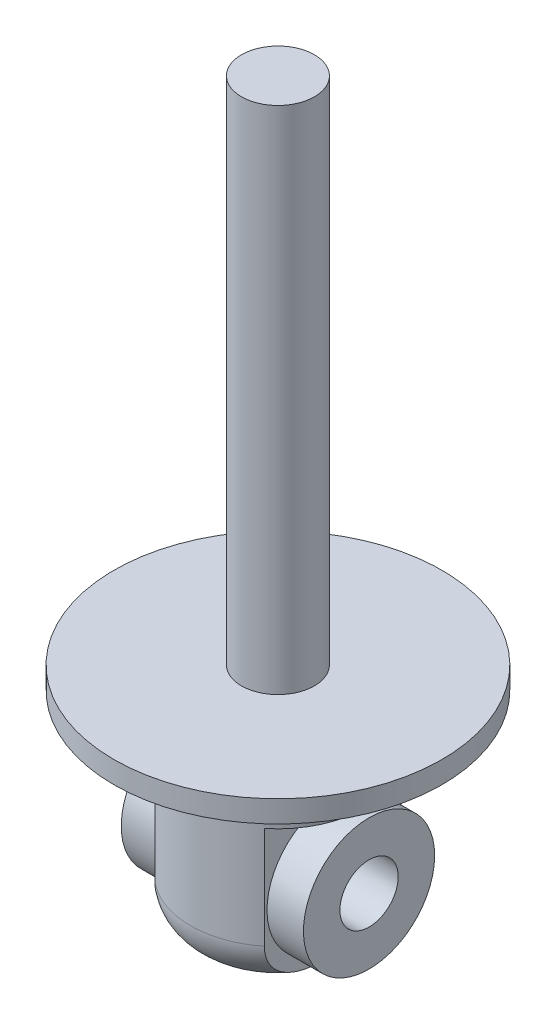
ISO-10303-21;
HEADER;
FILE_DESCRIPTION(('STEP AP214'),'2;1');
FILE_NAME('part.step','',(''),(''),'','','');
FILE_SCHEMA(('AUTOMOTIVE_DESIGN { 1 0 10303 214 1 1 1 1 }'));
ENDSEC;
DATA;
#1=APPLICATION_CONTEXT('core data for automotive mechanical design processes');
#2=APPLICATION_PROTOCOL_DEFINITION('international standard','automotive_design',2000,#1);
#3=PRODUCT_CONTEXT('',#1,'mechanical');
#4=PRODUCT('Part','Part','',(#3));
#5=PRODUCT_RELATED_PRODUCT_CATEGORY('part','',(#4));
#6=PRODUCT_DEFINITION_FORMATION('','',#4);
#7=PRODUCT_DEFINITION_CONTEXT('part definition',#1,'design');
#8=PRODUCT_DEFINITION('design','',#6,#7);
#9=PRODUCT_DEFINITION_SHAPE('','',#8);
#10=(LENGTH_UNIT() NAMED_UNIT(*) SI_UNIT(.MILLI.,.METRE.));
#11=(NAMED_UNIT(*) PLANE_ANGLE_UNIT() SI_UNIT($,.RADIAN.));
#12=(NAMED_UNIT(*) SI_UNIT($,.STERADIAN.) SOLID_ANGLE_UNIT());
#13=UNCERTAINTY_MEASURE_WITH_UNIT(LENGTH_MEASURE(1.E-05),#10,'distance_accuracy_value','');
#14=(GEOMETRIC_REPRESENTATION_CONTEXT(3) GLOBAL_UNCERTAINTY_ASSIGNED_CONTEXT((#13)) GLOBAL_UNIT_ASSIGNED_CONTEXT((#10,
#11,#12)) REPRESENTATION_CONTEXT('',''));
#15=CARTESIAN_POINT('',(0.,0.,0.));
#16=DIRECTION('',(0.,0.,1.));
#17=DIRECTION('',(1.,0.,0.));
#18=AXIS2_PLACEMENT_3D('',#15,#16,#17);
#19=CARTESIAN_POINT('',(-7.5,-8.00000000000001,28.));
#20=DIRECTION('',(-1.,0.,0.));
#21=DIRECTION('',(0.,-1.,0.));
#22=AXIS2_PLACEMENT_3D('',#19,#20,#21);
#23=PLANE('',#22);
#24=DIRECTION('',(0.,1.,0.));
#25=VECTOR('',#24,1.);
#26=CARTESIAN_POINT('',(-7.5,-28.,9.3674969975976));
#27=LINE('',#26,#25);
#28=CARTESIAN_POINT('',(-7.5,-22.,9.3674969975976));
#29=VERTEX_POINT('',#28);
#30=CARTESIAN_POINT('',(-7.5,-8.00000000000001,9.3674969975976));
#31=VERTEX_POINT('',#30);
#32=EDGE_CURVE('E80',#29,#31,#27,.T.);
#33=ORIENTED_EDGE('',*,*,#32,.T.);
#34=DIRECTION('',(0.,0.,-1.));
#35=VECTOR('',#34,1.);
#36=CARTESIAN_POINT('',(-7.5,-8.00000000000001,28.));
#37=LINE('',#36,#35);
#38=CARTESIAN_POINT('',(-7.5,-8.00000000000001,-9.3674969975976));
#39=VERTEX_POINT('',#38);
#40=EDGE_CURVE('E83',#31,#39,#37,.T.);
#41=ORIENTED_EDGE('',*,*,#40,.T.);
#42=DIRECTION('',(0.,1.,0.));
#43=VECTOR('',#42,1.);
#44=CARTESIAN_POINT('',(-7.5,-28.,-9.3674969975976));
#45=LINE('',#44,#43);
#46=CARTESIAN_POINT('',(-7.5,-22.,-9.3674969975976));
#47=VERTEX_POINT('',#46);
#48=EDGE_CURVE('E63',#39,#47,#45,.F.);
#49=ORIENTED_EDGE('',*,*,#48,.T.);
#50=CARTESIAN_POINT('',(-7.5,-27.8094750193111,0.));
#51=CARTESIAN_POINT('',(-7.5,-27.8094752958151,-0.184521628242419));
#52=CARTESIAN_POINT('',(-7.5,-27.8077270322999,-0.369043480287191));
#53=CARTESIAN_POINT('',(-7.5,-27.8006130628877,-0.737999394292284));
#54=CARTESIAN_POINT('',(-7.5,-27.7952477367066,-0.922433463434384));
#55=CARTESIAN_POINT('',(-7.5,-27.780538513706,-1.29122559425462));
#56=CARTESIAN_POINT('',(-7.5,-27.7711929215574,-1.47558358999919));
#57=CARTESIAN_POINT('',(-7.5,-27.7479507640883,-1.84401846668315));
#58=CARTESIAN_POINT('',(-7.5,-27.734054140347,-2.02809534398339));
#59=CARTESIAN_POINT('',(-7.5,-27.701027325669,-2.39498843631837));
#60=CARTESIAN_POINT('',(-7.5,-27.6819201299087,-2.57780665418326));
#61=CARTESIAN_POINT('',(-7.5,-27.6375682217561,-2.94269408038083));
#62=CARTESIAN_POINT('',(-7.5,-27.6123230495969,-3.12476323156505));
#63=CARTESIAN_POINT('',(-7.5,-27.5259360262262,-3.6691632505479));
#64=CARTESIAN_POINT('',(-7.5,-27.4541196223952,-4.02997739530099));
#65=CARTESIAN_POINT('',(-7.5,-27.315114172541,-4.57935988961709));
#66=CARTESIAN_POINT('',(-7.5,-27.2608348848703,-4.77122256452969));
#67=CARTESIAN_POINT('',(-7.5,-27.1402411036094,-5.15109529504942));
#68=CARTESIAN_POINT('',(-7.5,-27.0739312594077,-5.33910680786539));
#69=CARTESIAN_POINT('',(-7.5,-26.928148698992,-5.70992505463463));
#70=CARTESIAN_POINT('',(-7.5,-26.8486797977089,-5.8927332791208));
#71=CARTESIAN_POINT('',(-7.5,-26.6756224712841,-6.25155879665883));
#72=CARTESIAN_POINT('',(-7.5,-26.5820364486502,-6.42757723883459));
#73=CARTESIAN_POINT('',(-7.5,-26.3958384208508,-6.74413785402998));
#74=CARTESIAN_POINT('',(-7.5,-26.3053527427416,-6.8859302136676));
#75=CARTESIAN_POINT('',(-7.5,-26.1136422044668,-7.16205254122039));
#76=CARTESIAN_POINT('',(-7.5,-26.0124194056704,-7.29638393401336));
#77=CARTESIAN_POINT('',(-7.5,-25.7991822855038,-7.55627452274061));
#78=CARTESIAN_POINT('',(-7.5,-25.6871652583255,-7.6818315054992));
#79=CARTESIAN_POINT('',(-7.5,-25.4525813942248,-7.92270374400352));
#80=CARTESIAN_POINT('',(-7.5,-25.3300144777409,-8.03801892249803));
#81=CARTESIAN_POINT('',(-7.5,-25.0736714823962,-8.25792234562975));
#82=CARTESIAN_POINT('',(-7.5,-24.9398051473305,-8.36240569865935));
#83=CARTESIAN_POINT('',(-7.5,-24.662616920615,-8.55796576900282));
#84=CARTESIAN_POINT('',(-7.5,-24.5192963548439,-8.64904436046083));
#85=CARTESIAN_POINT('',(-7.5,-24.2243409104845,-8.81636481076627));
#86=CARTESIAN_POINT('',(-7.5,-24.0727112205184,-8.89261579636784));
#87=CARTESIAN_POINT('',(-7.5,-23.7624095052739,-9.02909243430965));
#88=CARTESIAN_POINT('',(-7.5,-23.6037388369551,-9.08932115899453));
#89=CARTESIAN_POINT('',(-7.5,-23.3052245459151,-9.1849514334904));
#90=CARTESIAN_POINT('',(-7.5,-23.1661361294911,-9.22272405795734));
#91=CARTESIAN_POINT('',(-7.5,-22.8851087613884,-9.28547940350164));
#92=CARTESIAN_POINT('',(-7.5,-22.7431701638949,-9.31046370365637));
#93=CARTESIAN_POINT('',(-7.5,-22.4576599589478,-9.34730641699016));
#94=CARTESIAN_POINT('',(-7.5,-22.3140890586128,-9.35917031033292));
#95=CARTESIAN_POINT('',(-7.5,-22.0264648581988,-9.36963164548865));
#96=CARTESIAN_POINT('',(-7.5,-21.8824115750842,-9.36822954903948));
#97=CARTESIAN_POINT('',(-7.5,-21.6061914815275,-9.35280339576898));
#98=CARTESIAN_POINT('',(-7.5,-21.4739684759154,-9.33976569953801));
#99=CARTESIAN_POINT('',(-7.5,-21.2110534946456,-9.30256363878721));
#100=CARTESIAN_POINT('',(-7.5,-21.0803620180608,-9.27839574533066));
#101=CARTESIAN_POINT('',(-7.5,-20.8215410609612,-9.21922065645586));
#102=CARTESIAN_POINT('',(-7.5,-20.6934101253726,-9.18421981495561));
#103=CARTESIAN_POINT('',(-7.5,-20.4404340442512,-9.10374552536161));
#104=CARTESIAN_POINT('',(-7.5,-20.3155901493276,-9.05826815366643));
#105=CARTESIAN_POINT('',(-7.5,-20.0692031015505,-8.95699564520569));
#106=CARTESIAN_POINT('',(-7.5,-19.9476868658852,-8.90113499399756));
#107=CARTESIAN_POINT('',(-7.5,-19.7094920695403,-8.77987692751897));
#108=CARTESIAN_POINT('',(-7.5,-19.5928152563103,-8.71447610526943));
#109=CARTESIAN_POINT('',(-7.5,-19.2509911073174,-8.50489875856372));
#110=CARTESIAN_POINT('',(-7.5,-19.0339195251877,-8.34729299116935));
#111=CARTESIAN_POINT('',(-7.5,-18.609337427954,-7.98870608163153));
#112=CARTESIAN_POINT('',(-7.5,-18.4039002281567,-7.78529755950601));
#113=CARTESIAN_POINT('',(-7.5,-18.0246758733926,-7.35109040646743));
#114=CARTESIAN_POINT('',(-7.5,-17.8508837047537,-7.12029612399674));
#115=CARTESIAN_POINT('',(-7.5,-17.5744409595824,-6.69864287979115));
#116=CARTESIAN_POINT('',(-7.5,-17.4648689537028,-6.51223410047273));
#117=CARTESIAN_POINT('',(-7.5,-17.2626904112623,-6.13034538679086));
#118=CARTESIAN_POINT('',(-7.5,-17.1700919878543,-5.93486117014359));
#119=CARTESIAN_POINT('',(-7.5,-17.0006313082269,-5.53658641063458));
#120=CARTESIAN_POINT('',(-7.5,-16.9238147555949,-5.33377659321381));
#121=CARTESIAN_POINT('',(-7.5,-16.784875362625,-4.92331428460811));
#122=CARTESIAN_POINT('',(-7.5,-16.7227484430634,-4.71566315546475));
#123=CARTESIAN_POINT('',(-7.5,-16.5386673542946,-4.02250667384636));
#124=CARTESIAN_POINT('',(-7.5,-16.4449803111871,-3.52942656369883));
#125=CARTESIAN_POINT('',(-7.5,-16.3412352530644,-2.78498720051468));
#126=CARTESIAN_POINT('',(-7.5,-16.3127705467372,-2.53568557770051));
#127=CARTESIAN_POINT('',(-7.5,-16.2658269581612,-2.0361243493744));
#128=CARTESIAN_POINT('',(-7.5,-16.2473468655649,-1.78586486368144));
#129=CARTESIAN_POINT('',(-7.5,-16.2184283009414,-1.28363112408655));
#130=CARTESIAN_POINT('',(-7.5,-16.208031590786,-1.03165466176094));
#131=CARTESIAN_POINT('',(-7.5,-16.1941849220444,-0.527501194688707));
#132=CARTESIAN_POINT('',(-7.5,-16.1907352988047,-0.27532418084894));
#133=CARTESIAN_POINT('',(-7.5,-16.1903333462322,0.228731345602946));
#134=CARTESIAN_POINT('',(-7.5,-16.193373232494,0.480609853630145));
#135=CARTESIAN_POINT('',(-7.5,-16.2063332691715,0.984173581494236));
#136=CARTESIAN_POINT('',(-7.5,-16.2162528039696,1.23585881660871));
#137=CARTESIAN_POINT('',(-7.5,-16.2454935008677,1.7627882566893));
#138=CARTESIAN_POINT('',(-7.5,-16.2656211327378,2.03798990109168));
#139=CARTESIAN_POINT('',(-7.5,-16.3180418431017,2.58731345976836));
#140=CARTESIAN_POINT('',(-7.5,-16.3503365349836,2.86143522597441));
#141=CARTESIAN_POINT('',(-7.5,-16.4300545548583,3.40623279358435));
#142=CARTESIAN_POINT('',(-7.5,-16.4774071358833,3.67691867401872));
#143=CARTESIAN_POINT('',(-7.5,-16.5907053400646,4.2143947607995));
#144=CARTESIAN_POINT('',(-7.5,-16.6566449229111,4.48118620316469));
#145=CARTESIAN_POINT('',(-7.5,-16.7911834026755,4.94217748017442));
#146=CARTESIAN_POINT('',(-7.5,-16.8549558474619,5.13778160857807));
#147=CARTESIAN_POINT('',(-7.5,-16.9961265709521,5.52399422741739));
#148=CARTESIAN_POINT('',(-7.5,-17.0735207892669,5.71460418712136));
#149=CARTESIAN_POINT('',(-7.5,-17.2430793617625,6.08921987221889));
#150=CARTESIAN_POINT('',(-7.5,-17.3352463319138,6.27322442084438));
#151=CARTESIAN_POINT('',(-7.5,-17.5351759469553,6.63256976145457));
#152=CARTESIAN_POINT('',(-7.5,-17.6429345063483,6.80791280693597));
#153=CARTESIAN_POINT('',(-7.5,-17.8487615005736,7.10989658300673));
#154=CARTESIAN_POINT('',(-7.5,-17.9436617626469,7.23870103997639));
#155=CARTESIAN_POINT('',(-7.5,-18.143229826346,7.48856622066219));
#156=CARTESIAN_POINT('',(-7.5,-18.2478987883735,7.60962602152204));
#157=CARTESIAN_POINT('',(-7.5,-18.4668045949393,7.84271387792474));
#158=CARTESIAN_POINT('',(-7.5,-18.5810384459287,7.95474473789612));
#159=CARTESIAN_POINT('',(-7.5,-18.8187268203134,8.16854933672494));
#160=CARTESIAN_POINT('',(-7.5,-18.9421800591116,8.27032449994957));
#161=CARTESIAN_POINT('',(-7.5,-19.1987356397018,8.46313596223061));
#162=CARTESIAN_POINT('',(-7.5,-19.3319055781875,8.55408255407203));
#163=CARTESIAN_POINT('',(-7.5,-19.6061418402457,8.72304401015934));
#164=CARTESIAN_POINT('',(-7.5,-19.747204378254,8.80106500403696));
#165=CARTESIAN_POINT('',(-7.5,-20.0362068877473,8.94309470867639));
#166=CARTESIAN_POINT('',(-7.5,-20.1841460034049,9.00710515749598));
#167=CARTESIAN_POINT('',(-7.5,-20.4856380297523,9.12014361193693));
#168=CARTESIAN_POINT('',(-7.5,-20.6391901444676,9.16917373274798));
#169=CARTESIAN_POINT('',(-7.5,-20.9313639562727,9.24643392787081));
#170=CARTESIAN_POINT('',(-7.5,-21.0695088202567,9.2764768563288));
#171=CARTESIAN_POINT('',(-7.5,-21.3479315795213,9.32406143536891));
#172=CARTESIAN_POINT('',(-7.5,-21.4882092809527,9.34160421520928));
#173=CARTESIAN_POINT('',(-7.5,-21.769719609589,9.36396002322678));
#174=CARTESIAN_POINT('',(-7.5,-21.9109518422674,9.36877802253041));
#175=CARTESIAN_POINT('',(-7.5,-22.1932734390957,9.36563613906261));
#176=CARTESIAN_POINT('',(-7.5,-22.3343628067459,9.35767657732182));
#177=CARTESIAN_POINT('',(-7.5,-22.6064011749062,9.32998563551062));
#178=CARTESIAN_POINT('',(-7.5,-22.7374295539783,9.31102660205279));
#179=CARTESIAN_POINT('',(-7.5,-22.9974780227225,9.26218788836622));
#180=CARTESIAN_POINT('',(-7.5,-23.1264974548056,9.23230470755187));
#181=CARTESIAN_POINT('',(-7.5,-23.3815508516768,9.16196479385525));
#182=CARTESIAN_POINT('',(-7.5,-23.5075862018083,9.12151307666088));
#183=CARTESIAN_POINT('',(-7.5,-23.7559772755244,9.03044888037393));
#184=CARTESIAN_POINT('',(-7.5,-23.8783315975104,8.97983258590813));
#185=CARTESIAN_POINT('',(-7.5,-24.1205569584555,8.8680617574251));
#186=CARTESIAN_POINT('',(-7.5,-24.2403549182387,8.80674877020291));
#187=CARTESIAN_POINT('',(-7.5,-24.4747211723639,8.67480187441993));
#188=CARTESIAN_POINT('',(-7.5,-24.5892875713423,8.60416462323317));
#189=CARTESIAN_POINT('',(-7.5,-24.9242270275788,8.37928997825773));
#190=CARTESIAN_POINT('',(-7.5,-25.13600210755,8.21201407264852));
#191=CARTESIAN_POINT('',(-7.5,-25.5504485361803,7.832942739178));
#192=CARTESIAN_POINT('',(-7.5,-25.7507010772538,7.61853228584699));
#193=CARTESIAN_POINT('',(-7.5,-26.1185076671662,7.16337882817298));
#194=CARTESIAN_POINT('',(-7.5,-26.2860513710234,6.92262753032979));
#195=CARTESIAN_POINT('',(-7.5,-26.5545024709803,6.4788664395953));
#196=CARTESIAN_POINT('',(-7.5,-26.6619013252763,6.279707295078));
#197=CARTESIAN_POINT('',(-7.5,-26.858559219587,5.87254463104013));
#198=CARTESIAN_POINT('',(-7.5,-26.9478095430477,5.66453691936401));
#199=CARTESIAN_POINT('',(-7.5,-27.1096214973705,5.24180758530233));
#200=CARTESIAN_POINT('',(-7.5,-27.1821555960046,5.02707553901331));
#201=CARTESIAN_POINT('',(-7.5,-27.3121001369762,4.59305326757356));
#202=CARTESIAN_POINT('',(-7.5,-27.3695048137837,4.37376133898656));
#203=CARTESIAN_POINT('',(-7.5,-27.4981886749365,3.81417726059937));
#204=CARTESIAN_POINT('',(-7.5,-27.5604951716191,3.47183296905169));
#205=CARTESIAN_POINT('',(-7.5,-27.6609019684328,2.78359200614869));
#206=CARTESIAN_POINT('',(-7.5,-27.6989863972919,2.43769315620305));
#207=CARTESIAN_POINT('',(-7.5,-27.7425563308733,1.91723181279187));
#208=CARTESIAN_POINT('',(-7.5,-27.7548291128016,1.74318957751326));
#209=CARTESIAN_POINT('',(-7.5,-27.7753986995787,1.39487161182966));
#210=CARTESIAN_POINT('',(-7.5,-27.7836956019396,1.22059588725637));
#211=CARTESIAN_POINT('',(-7.5,-27.796777523185,0.871965392986035));
#212=CARTESIAN_POINT('',(-7.5,-27.8015635129394,0.697610658492168));
#213=CARTESIAN_POINT('',(-7.5,-27.8079121855994,0.348837350643893));
#214=CARTESIAN_POINT('',(-7.5,-27.8094747579462,0.174418775305038));
#215=CARTESIAN_POINT('',(-7.5,-27.8094750193111,0.));
#216=B_SPLINE_CURVE_WITH_KNOTS('',3,(#50,#51,#52,#53,#54,#55,#56,#57,#58,#59,#60,#61,#62,#63,
#64,#65,#66,#67,#68,#69,#70,#71,#72,#73,#74,#75,#76,#77,#78,#79,#80,#81,#82,#83,#84,#85,#86,#87,
#88,#89,#90,#91,#92,#93,#94,#95,#96,#97,#98,#99,#100,#101,#102,#103,#104,#105,#106,#107,#108,
#109,#110,#111,#112,#113,#114,#115,#116,#117,#118,#119,#120,#121,#122,#123,#124,#125,#126,#127,
#128,#129,#130,#131,#132,#133,#134,#135,#136,#137,#138,#139,#140,#141,#142,#143,#144,#145,#146,
#147,#148,#149,#150,#151,#152,#153,#154,#155,#156,#157,#158,#159,#160,#161,#162,#163,#164,#165,
#166,#167,#168,#169,#170,#171,#172,#173,#174,#175,#176,#177,#178,#179,#180,#181,#182,#183,#184,
#185,#186,#187,#188,#189,#190,#191,#192,#193,#194,#195,#196,#197,#198,#199,#200,#201,#202,#203,
#204,#205,#206,#207,#208,#209,#210,#211,#212,#213,#214,#215),.UNSPECIFIED.,.T.,.F.,(4,2,2,2,2,2,
2,2,2,2,2,2,2,2,2,2,2,2,2,2,2,2,2,2,2,2,2,2,2,2,2,2,2,2,2,2,2,2,2,2,2,2,2,2,2,2,2,2,2,2,2,2,2,2,
2,2,2,2,2,2,2,2,2,2,2,2,2,2,2,2,2,2,2,2,2,2,2,2,2,2,2,2,4),(0.,0.553556541747908,
1.10705498067111,1.6607894093517,2.21453094651203,2.76586720349669,3.31724477121585,
4.41912680182766,5.01698525599297,5.61461314908642,6.21206808675634,6.80942146164093,
7.31357153503217,7.81762499361292,8.32180513447662,8.82598907791493,9.33467160980088,
9.84328295415676,10.3515802378956,10.8597799828438,11.291588037567,11.7233427606026,
12.1549170790764,12.5864763761706,12.9845986570771,13.3828472534997,13.7808627038906,
14.1790274594522,14.579795450788,14.9807069160888,15.7821103743006,16.6461503316802,
17.5100532757815,18.1578732554314,18.8060020817716,19.4559821948789,20.1057815998326,
21.6069748462105,22.3596793389022,23.1122925673176,23.8687687149109,24.6252813779039,
25.3808870860738,26.1364251884592,26.9640249034878,27.7917343993232,28.6156111127982,
29.4392203950451,30.0559954213971,30.6725869093732,31.2892877047367,31.9058271963482,
32.3853559200308,32.8649416785199,33.3443778968313,33.823747436381,34.3068464150843,
34.7897156366603,35.2725249226045,35.7552660053908,36.1788379642465,36.6023716529343,
37.0257398573389,37.4490974249689,37.8458122806135,38.2426543730445,38.639308470493,
39.0361117351622,39.4393886143668,39.8428104576492,40.6491243408277,41.5260051520067,
42.4031628508039,43.0810551134699,43.7592721958252,44.4385984678267,45.1181832448308,
46.1608437011148,47.2041866484774,47.7275747628343,48.2509500399341,48.7741805338585,
49.2974289735857),.UNSPECIFIED.);
#217=EDGE_CURVE('E84',#29,#47,#216,.T.);
#218=ORIENTED_EDGE('',*,*,#217,.F.);
#219=EDGE_LOOP('',(#33,#41,#49,#218));
#220=FACE_BOUND('',#219,.T.);
#221=CARTESIAN_POINT('',(-7.5,-17.904737612284,0.));
#222=DIRECTION('',(-1.,0.,0.));
#223=DIRECTION('',(0.,-1.,0.));
#224=AXIS2_PLACEMENT_3D('',#221,#222,#223);
#225=CIRCLE('',#224,9.);
#226=CARTESIAN_POINT('',(-7.5,-26.904737612284,0.));
#227=VERTEX_POINT('',#226);
#228=EDGE_CURVE('E93',#227,#227,#225,.F.);
#229=ORIENTED_EDGE('',*,*,#228,.T.);
#230=EDGE_LOOP('',(#229));
#231=FACE_BOUND('',#230,.T.);
#232=ADVANCED_FACE('F38',(#220,#231),#23,.T.);
#233=CARTESIAN_POINT('',(7.5,-8.,28.));
#234=DIRECTION('',(1.,0.,0.));
#235=DIRECTION('',(0.,1.,0.));
#236=AXIS2_PLACEMENT_3D('',#233,#234,#235);
#237=PLANE('',#236);
#238=DIRECTION('',(0.,1.,0.));
#239=VECTOR('',#238,1.);
#240=CARTESIAN_POINT('',(7.5,-28.,-9.3674969975976));
#241=LINE('',#240,#239);
#242=CARTESIAN_POINT('',(7.5,-22.,-9.3674969975976));
#243=VERTEX_POINT('',#242);
#244=CARTESIAN_POINT('',(7.5,-8.,-9.3674969975976));
#245=VERTEX_POINT('',#244);
#246=EDGE_CURVE('E169',#243,#245,#241,.T.);
#247=ORIENTED_EDGE('',*,*,#246,.T.);
#248=DIRECTION('',(0.,0.,-1.));
#249=VECTOR('',#248,1.);
#250=CARTESIAN_POINT('',(7.5,-8.,28.));
#251=LINE('',#250,#249);
#252=CARTESIAN_POINT('',(7.5,-8.,9.3674969975976));
#253=VERTEX_POINT('',#252);
#254=EDGE_CURVE('E92',#253,#245,#251,.T.);
#255=ORIENTED_EDGE('',*,*,#254,.F.);
#256=DIRECTION('',(0.,1.,0.));
#257=VECTOR('',#256,1.);
#258=CARTESIAN_POINT('',(7.5,-28.,9.3674969975976));
#259=LINE('',#258,#257);
#260=CARTESIAN_POINT('',(7.5,-22.,9.3674969975976));
#261=VERTEX_POINT('',#260);
#262=EDGE_CURVE('E55',#253,#261,#259,.F.);
#263=ORIENTED_EDGE('',*,*,#262,.T.);
#264=CARTESIAN_POINT('',(7.5,-27.8094750193111,0.));
#265=CARTESIAN_POINT('',(7.5,-27.8094752958151,0.18452162824242));
#266=CARTESIAN_POINT('',(7.5,-27.8077270322999,0.369043480287192));
#267=CARTESIAN_POINT('',(7.5,-27.8006130628877,0.737999394292286));
#268=CARTESIAN_POINT('',(7.5,-27.7952477367066,0.922433463434386));
#269=CARTESIAN_POINT('',(7.5,-27.780538513706,1.29122559425462));
#270=CARTESIAN_POINT('',(7.5,-27.7711929215574,1.47558358999919));
#271=CARTESIAN_POINT('',(7.5,-27.7479507640883,1.84401846668315));
#272=CARTESIAN_POINT('',(7.5,-27.734054140347,2.0280953439834));
#273=CARTESIAN_POINT('',(7.5,-27.701027325669,2.39498843631837));
#274=CARTESIAN_POINT('',(7.5,-27.6819201299087,2.57780665418327));
#275=CARTESIAN_POINT('',(7.5,-27.6375682217561,2.94269408038084));
#276=CARTESIAN_POINT('',(7.5,-27.6123230495969,3.12476323156505));
#277=CARTESIAN_POINT('',(7.5,-27.5259360262262,3.6691632505479));
#278=CARTESIAN_POINT('',(7.5,-27.4541196223952,4.029977395301));
#279=CARTESIAN_POINT('',(7.5,-27.315114172541,4.57935988961709));
#280=CARTESIAN_POINT('',(7.5,-27.2608348848703,4.7712225645297));
#281=CARTESIAN_POINT('',(7.5,-27.1402411036094,5.15109529504943));
#282=CARTESIAN_POINT('',(7.5,-27.0739312594077,5.3391068078654));
#283=CARTESIAN_POINT('',(7.5,-26.9281486989919,5.70992505463463));
#284=CARTESIAN_POINT('',(7.5,-26.8486797977089,5.8927332791208));
#285=CARTESIAN_POINT('',(7.5,-26.6756224712841,6.25155879665883));
#286=CARTESIAN_POINT('',(7.5,-26.5820364486501,6.42757723883459));
#287=CARTESIAN_POINT('',(7.5,-26.3958384208508,6.74413785402998));
#288=CARTESIAN_POINT('',(7.5,-26.3053527427416,6.8859302136676));
#289=CARTESIAN_POINT('',(7.5,-26.1136422044668,7.16205254122039));
#290=CARTESIAN_POINT('',(7.5,-26.0124194056704,7.29638393401336));
#291=CARTESIAN_POINT('',(7.5,-25.7991822855038,7.55627452274061));
#292=CARTESIAN_POINT('',(7.5,-25.6871652583255,7.6818315054992));
#293=CARTESIAN_POINT('',(7.5,-25.4525813942248,7.92270374400352));
#294=CARTESIAN_POINT('',(7.5,-25.3300144777409,8.03801892249803));
#295=CARTESIAN_POINT('',(7.5,-25.0736714823962,8.25792234562975));
#296=CARTESIAN_POINT('',(7.5,-24.9398051473305,8.36240569865935));
#297=CARTESIAN_POINT('',(7.5,-24.662616920615,8.55796576900282));
#298=CARTESIAN_POINT('',(7.5,-24.5192963548439,8.64904436046083));
#299=CARTESIAN_POINT('',(7.5,-24.2243409104845,8.81636481076627));
#300=CARTESIAN_POINT('',(7.5,-24.0727112205184,8.89261579636783));
#301=CARTESIAN_POINT('',(7.5,-23.7624095052739,9.02909243430965));
#302=CARTESIAN_POINT('',(7.5,-23.6037388369551,9.08932115899453));
#303=CARTESIAN_POINT('',(7.5,-23.3052245459151,9.1849514334904));
#304=CARTESIAN_POINT('',(7.5,-23.166136129491,9.22272405795733));
#305=CARTESIAN_POINT('',(7.5,-22.8851087613884,9.28547940350163));
#306=CARTESIAN_POINT('',(7.5,-22.7431701638949,9.31046370365637));
#307=CARTESIAN_POINT('',(7.5,-22.4576599589478,9.34730641699015));
#308=CARTESIAN_POINT('',(7.5,-22.3140890586128,9.35917031033292));
#309=CARTESIAN_POINT('',(7.5,-22.0264648581988,9.36963164548865));
#310=CARTESIAN_POINT('',(7.5,-21.8824115750842,9.36822954903947));
#311=CARTESIAN_POINT('',(7.5,-21.6061914815275,9.35280339576898));
#312=CARTESIAN_POINT('',(7.5,-21.4739684759153,9.33976569953801));
#313=CARTESIAN_POINT('',(7.5,-21.2110534946456,9.3025636387872));
#314=CARTESIAN_POINT('',(7.5,-21.0803620180608,9.27839574533065));
#315=CARTESIAN_POINT('',(7.5,-20.8215410609612,9.21922065645586));
#316=CARTESIAN_POINT('',(7.5,-20.6934101253726,9.1842198149556));
#317=CARTESIAN_POINT('',(7.5,-20.4404340442512,9.1037455253616));
#318=CARTESIAN_POINT('',(7.5,-20.3155901493276,9.05826815366643));
#319=CARTESIAN_POINT('',(7.5,-20.0692031015505,8.95699564520569));
#320=CARTESIAN_POINT('',(7.5,-19.9476868658852,8.90113499399755));
#321=CARTESIAN_POINT('',(7.5,-19.7094920695403,8.77987692751896));
#322=CARTESIAN_POINT('',(7.5,-19.5928152563103,8.71447610526942));
#323=CARTESIAN_POINT('',(7.5,-19.2509911073174,8.50489875856371));
#324=CARTESIAN_POINT('',(7.5,-19.0339195251877,8.34729299116933));
#325=CARTESIAN_POINT('',(7.5,-18.609337427954,7.98870608163152));
#326=CARTESIAN_POINT('',(7.5,-18.4039002281567,7.78529755950601));
#327=CARTESIAN_POINT('',(7.5,-18.0246758733926,7.35109040646742));
#328=CARTESIAN_POINT('',(7.5,-17.8508837047537,7.12029612399674));
#329=CARTESIAN_POINT('',(7.5,-17.5744409595824,6.69864287979114));
#330=CARTESIAN_POINT('',(7.5,-17.4648689537028,6.51223410047272));
#331=CARTESIAN_POINT('',(7.5,-17.2626904112622,6.13034538679085));
#332=CARTESIAN_POINT('',(7.5,-17.1700919878543,5.93486117014358));
#333=CARTESIAN_POINT('',(7.5,-17.0006313082269,5.53658641063457));
#334=CARTESIAN_POINT('',(7.5,-16.9238147555949,5.33377659321379));
#335=CARTESIAN_POINT('',(7.5,-16.784875362625,4.92331428460809));
#336=CARTESIAN_POINT('',(7.5,-16.7227484430634,4.71566315546473));
#337=CARTESIAN_POINT('',(7.5,-16.5386673542946,4.02250667384634));
#338=CARTESIAN_POINT('',(7.5,-16.4449803111871,3.5294265636988));
#339=CARTESIAN_POINT('',(7.5,-16.3412352530644,2.78498720051465));
#340=CARTESIAN_POINT('',(7.5,-16.3127705467372,2.53568557770048));
#341=CARTESIAN_POINT('',(7.5,-16.2658269581612,2.03612434937437));
#342=CARTESIAN_POINT('',(7.5,-16.2473468655649,1.7858648636814));
#343=CARTESIAN_POINT('',(7.5,-16.2184283009414,1.28363112408651));
#344=CARTESIAN_POINT('',(7.5,-16.208031590786,1.0316546617609));
#345=CARTESIAN_POINT('',(7.5,-16.1941849220444,0.527501194688666));
#346=CARTESIAN_POINT('',(7.5,-16.1907352988047,0.275324180848896));
#347=CARTESIAN_POINT('',(7.5,-16.1903333462322,-0.228731345602991));
#348=CARTESIAN_POINT('',(7.5,-16.193373232494,-0.480609853630189));
#349=CARTESIAN_POINT('',(7.5,-16.2063332691715,-0.984173581494281));
#350=CARTESIAN_POINT('',(7.5,-16.2162528039696,-1.23585881660875));
#351=CARTESIAN_POINT('',(7.5,-16.2454935008677,-1.76278825668935));
#352=CARTESIAN_POINT('',(7.5,-16.2656211327378,-2.03798990109173));
#353=CARTESIAN_POINT('',(7.5,-16.3180418431018,-2.5873134597684));
#354=CARTESIAN_POINT('',(7.5,-16.3503365349836,-2.86143522597445));
#355=CARTESIAN_POINT('',(7.5,-16.4300545548583,-3.40623279358438));
#356=CARTESIAN_POINT('',(7.5,-16.4774071358833,-3.67691867401874));
#357=CARTESIAN_POINT('',(7.5,-16.5907053400646,-4.21439476079952));
#358=CARTESIAN_POINT('',(7.5,-16.6566449229111,-4.48118620316471));
#359=CARTESIAN_POINT('',(7.5,-16.7911834026755,-4.94217748017443));
#360=CARTESIAN_POINT('',(7.5,-16.8549558474619,-5.13778160857808));
#361=CARTESIAN_POINT('',(7.5,-16.9961265709521,-5.5239942274174));
#362=CARTESIAN_POINT('',(7.5,-17.073520789267,-5.71460418712137));
#363=CARTESIAN_POINT('',(7.5,-17.2430793617625,-6.0892198722189));
#364=CARTESIAN_POINT('',(7.5,-17.3352463319138,-6.27322442084439));
#365=CARTESIAN_POINT('',(7.5,-17.5351759469553,-6.63256976145458));
#366=CARTESIAN_POINT('',(7.5,-17.6429345063483,-6.80791280693598));
#367=CARTESIAN_POINT('',(7.5,-17.8487615005737,-7.10989658300674));
#368=CARTESIAN_POINT('',(7.5,-17.9436617626469,-7.2387010399764));
#369=CARTESIAN_POINT('',(7.5,-18.143229826346,-7.48856622066219));
#370=CARTESIAN_POINT('',(7.5,-18.2478987883735,-7.60962602152205));
#371=CARTESIAN_POINT('',(7.5,-18.4668045949393,-7.84271387792474));
#372=CARTESIAN_POINT('',(7.5,-18.5810384459287,-7.95474473789612));
#373=CARTESIAN_POINT('',(7.5,-18.8187268203134,-8.16854933672494));
#374=CARTESIAN_POINT('',(7.5,-18.9421800591116,-8.27032449994957));
#375=CARTESIAN_POINT('',(7.5,-19.1987356397018,-8.46313596223061));
#376=CARTESIAN_POINT('',(7.5,-19.3319055781875,-8.55408255407203));
#377=CARTESIAN_POINT('',(7.5,-19.6061418402457,-8.72304401015934));
#378=CARTESIAN_POINT('',(7.5,-19.747204378254,-8.80106500403696));
#379=CARTESIAN_POINT('',(7.5,-20.0362068877473,-8.94309470867639));
#380=CARTESIAN_POINT('',(7.5,-20.1841460034049,-9.00710515749598));
#381=CARTESIAN_POINT('',(7.5,-20.4856380297523,-9.12014361193692));
#382=CARTESIAN_POINT('',(7.5,-20.6391901444676,-9.16917373274798));
#383=CARTESIAN_POINT('',(7.5,-20.9313639562727,-9.24643392787081));
#384=CARTESIAN_POINT('',(7.5,-21.0695088202567,-9.27647685632879));
#385=CARTESIAN_POINT('',(7.5,-21.3479315795213,-9.32406143536891));
#386=CARTESIAN_POINT('',(7.5,-21.4882092809527,-9.34160421520928));
#387=CARTESIAN_POINT('',(7.5,-21.769719609589,-9.36396002322678));
#388=CARTESIAN_POINT('',(7.5,-21.9109518422674,-9.36877802253041));
#389=CARTESIAN_POINT('',(7.5,-22.1932734390957,-9.3656361390626));
#390=CARTESIAN_POINT('',(7.5,-22.3343628067459,-9.35767657732181));
#391=CARTESIAN_POINT('',(7.5,-22.6064011749062,-9.32998563551062));
#392=CARTESIAN_POINT('',(7.5,-22.7374295539783,-9.31102660205278));
#393=CARTESIAN_POINT('',(7.5,-22.9974780227225,-9.26218788836621));
#394=CARTESIAN_POINT('',(7.5,-23.1264974548056,-9.23230470755187));
#395=CARTESIAN_POINT('',(7.5,-23.3815508516768,-9.16196479385525));
#396=CARTESIAN_POINT('',(7.5,-23.5075862018084,-9.12151307666088));
#397=CARTESIAN_POINT('',(7.5,-23.7559772755244,-9.03044888037393));
#398=CARTESIAN_POINT('',(7.5,-23.8783315975104,-8.97983258590813));
#399=CARTESIAN_POINT('',(7.5,-24.1205569584555,-8.8680617574251));
#400=CARTESIAN_POINT('',(7.5,-24.2403549182387,-8.8067487702029));
#401=CARTESIAN_POINT('',(7.5,-24.4747211723639,-8.67480187441993));
#402=CARTESIAN_POINT('',(7.5,-24.5892875713423,-8.60416462323317));
#403=CARTESIAN_POINT('',(7.5,-24.9242270275788,-8.37928997825773));
#404=CARTESIAN_POINT('',(7.5,-25.13600210755,-8.21201407264852));
#405=CARTESIAN_POINT('',(7.5,-25.5504485361803,-7.832942739178));
#406=CARTESIAN_POINT('',(7.5,-25.7507010772538,-7.61853228584699));
#407=CARTESIAN_POINT('',(7.5,-26.1185076671662,-7.16337882817298));
#408=CARTESIAN_POINT('',(7.5,-26.2860513710234,-6.92262753032979));
#409=CARTESIAN_POINT('',(7.5,-26.5545024709803,-6.4788664395953));
#410=CARTESIAN_POINT('',(7.5,-26.6619013252763,-6.27970729507799));
#411=CARTESIAN_POINT('',(7.5,-26.858559219587,-5.87254463104012));
#412=CARTESIAN_POINT('',(7.5,-26.9478095430477,-5.664536919364));
#413=CARTESIAN_POINT('',(7.5,-27.1096214973705,-5.24180758530232));
#414=CARTESIAN_POINT('',(7.5,-27.1821555960046,-5.0270755390133));
#415=CARTESIAN_POINT('',(7.5,-27.3121001369762,-4.59305326757355));
#416=CARTESIAN_POINT('',(7.5,-27.3695048137837,-4.37376133898655));
#417=CARTESIAN_POINT('',(7.5,-27.4981886749365,-3.81417726059936));
#418=CARTESIAN_POINT('',(7.5,-27.5604951716191,-3.47183296905169));
#419=CARTESIAN_POINT('',(7.5,-27.6609019684328,-2.78359200614869));
#420=CARTESIAN_POINT('',(7.5,-27.6989863972919,-2.43769315620304));
#421=CARTESIAN_POINT('',(7.5,-27.7425563308733,-1.91723181279187));
#422=CARTESIAN_POINT('',(7.5,-27.7548291128016,-1.74318957751326));
#423=CARTESIAN_POINT('',(7.5,-27.7753986995787,-1.39487161182967));
#424=CARTESIAN_POINT('',(7.5,-27.7836956019396,-1.22059588725638));
#425=CARTESIAN_POINT('',(7.5,-27.796777523185,-0.87196539298604));
#426=CARTESIAN_POINT('',(7.5,-27.8015635129394,-0.697610658492171));
#427=CARTESIAN_POINT('',(7.5,-27.8079121855994,-0.348837350643893));
#428=CARTESIAN_POINT('',(7.5,-27.8094747579462,-0.174418775305038));
#429=CARTESIAN_POINT('',(7.5,-27.8094750193111,0.));
#430=B_SPLINE_CURVE_WITH_KNOTS('',3,(#264,#265,#266,#267,#268,#269,#270,#271,#272,#273,#274,
#275,#276,#277,#278,#279,#280,#281,#282,#283,#284,#285,#286,#287,#288,#289,#290,#291,#292,#293,
#294,#295,#296,#297,#298,#299,#300,#301,#302,#303,#304,#305,#306,#307,#308,#309,#310,#311,#312,
#313,#314,#315,#316,#317,#318,#319,#320,#321,#322,#323,#324,#325,#326,#327,#328,#329,#330,#331,
#332,#333,#334,#335,#336,#337,#338,#339,#340,#341,#342,#343,#344,#345,#346,#347,#348,#349,#350,
#351,#352,#353,#354,#355,#356,#357,#358,#359,#360,#361,#362,#363,#364,#365,#366,#367,#368,#369,
#370,#371,#372,#373,#374,#375,#376,#377,#378,#379,#380,#381,#382,#383,#384,#385,#386,#387,#388,
#389,#390,#391,#392,#393,#394,#395,#396,#397,#398,#399,#400,#401,#402,#403,#404,#405,#406,#407,
#408,#409,#410,#411,#412,#413,#414,#415,#416,#417,#418,#419,#420,#421,#422,#423,#424,#425,#426,
#427,#428,#429),.UNSPECIFIED.,.T.,.F.,(4,2,2,2,2,2,2,2,2,2,2,2,2,2,2,2,2,2,2,2,2,2,2,2,2,2,2,2,
2,2,2,2,2,2,2,2,2,2,2,2,2,2,2,2,2,2,2,2,2,2,2,2,2,2,2,2,2,2,2,2,2,2,2,2,2,2,2,2,2,2,2,2,2,2,2,2,
2,2,2,2,2,2,4),(0.,0.553556541747909,1.10705498067111,1.66078940935171,2.21453094651203,
2.7658672034967,3.31724477121586,4.41912680182767,5.01698525599298,5.61461314908642,
6.21206808675634,6.80942146164093,7.31357153503217,7.81762499361292,8.32180513447662,
8.82598907791494,9.33467160980089,9.84328295415677,10.3515802378956,10.8597799828438,
11.291588037567,11.7233427606026,12.1549170790764,12.5864763761707,12.9845986570771,
13.3828472534997,13.7808627038906,14.1790274594522,14.579795450788,14.9807069160888,
15.7821103743006,16.6461503316802,17.5100532757815,18.1578732554314,18.8060020817716,
19.4559821948789,20.1057815998326,21.6069748462106,22.3596793389022,23.1122925673176,
23.8687687149109,24.6252813779039,25.3808870860739,26.1364251884592,26.9640249034878,
27.7917343993232,28.6156111127982,29.4392203950451,30.0559954213971,30.6725869093732,
31.2892877047367,31.9058271963483,32.3853559200308,32.8649416785199,33.3443778968313,
33.823747436381,34.3068464150843,34.7897156366603,35.2725249226045,35.7552660053908,
36.1788379642465,36.6023716529342,37.0257398573389,37.4490974249688,37.8458122806135,
38.2426543730445,38.6393084704929,39.0361117351622,39.4393886143667,39.8428104576491,
40.6491243408276,41.5260051520067,42.4031628508039,43.0810551134699,43.7592721958252,
44.4385984678267,45.1181832448308,46.1608437011148,47.2041866484774,47.7275747628343,
48.2509500399341,48.7741805338585,49.2974289735857),.UNSPECIFIED.);
#431=EDGE_CURVE('E98',#243,#261,#430,.T.);
#432=ORIENTED_EDGE('',*,*,#431,.F.);
#433=EDGE_LOOP('',(#247,#255,#263,#432));
#434=FACE_BOUND('',#433,.T.);
#435=CARTESIAN_POINT('',(7.5,-17.904737612284,0.));
#436=DIRECTION('',(1.,0.,0.));
#437=DIRECTION('',(0.,1.,0.));
#438=AXIS2_PLACEMENT_3D('',#435,#436,#437);
#439=CIRCLE('',#438,9.);
#440=CARTESIAN_POINT('',(7.5,-8.90473761228401,0.));
#441=VERTEX_POINT('',#440);
#442=EDGE_CURVE('E43',#441,#441,#439,.F.);
#443=ORIENTED_EDGE('',*,*,#442,.T.);
#444=EDGE_LOOP('',(#443));
#445=FACE_BOUND('',#444,.T.);
#446=ADVANCED_FACE('F111',(#434,#445),#237,.T.);
#447=CARTESIAN_POINT('',(0.,-28.,0.));
#448=DIRECTION('',(0.,1.,0.));
#449=DIRECTION('',(0.,0.,1.));
#450=AXIS2_PLACEMENT_3D('',#447,#448,#449);
#451=CYLINDRICAL_SURFACE('',#450,12.);
#452=CARTESIAN_POINT('',(0.,0.,0.));
#453=DIRECTION('',(0.,-1.,0.));
#454=DIRECTION('',(0.,0.,-1.));
#455=AXIS2_PLACEMENT_3D('',#452,#453,#454);
#456=CIRCLE('',#455,12.);
#457=CARTESIAN_POINT('',(0.,0.,-12.));
#458=VERTEX_POINT('',#457);
#459=EDGE_CURVE('E176',#458,#458,#456,.T.);
#460=ORIENTED_EDGE('',*,*,#459,.T.);
#461=EDGE_LOOP('',(#460));
#462=FACE_BOUND('',#461,.T.);
#463=ORIENTED_EDGE('',*,*,#246,.F.);
#464=CARTESIAN_POINT('',(0.,-22.,0.));
#465=DIRECTION('',(0.,-1.,0.));
#466=DIRECTION('',(0.,0.,-1.));
#467=AXIS2_PLACEMENT_3D('',#464,#465,#466);
#468=CIRCLE('',#467,12.);
#469=EDGE_CURVE('E175',#243,#47,#468,.F.);
#470=ORIENTED_EDGE('',*,*,#469,.T.);
#471=ORIENTED_EDGE('',*,*,#48,.F.);
#472=CARTESIAN_POINT('',(0.,-8.,0.));
#473=DIRECTION('',(0.,-1.,0.));
#474=DIRECTION('',(1.,0.,0.));
#475=AXIS2_PLACEMENT_3D('',#472,#473,#474);
#476=CIRCLE('',#475,12.);
#477=EDGE_CURVE('E48',#31,#39,#476,.T.);
#478=ORIENTED_EDGE('',*,*,#477,.F.);
#479=ORIENTED_EDGE('',*,*,#32,.F.);
#480=EDGE_CURVE('E177',#29,#261,#468,.F.);
#481=ORIENTED_EDGE('',*,*,#480,.T.);
#482=ORIENTED_EDGE('',*,*,#262,.F.);
#483=CARTESIAN_POINT('',(0.,-8.,0.));
#484=DIRECTION('',(0.,-1.,0.));
#485=DIRECTION('',(1.,0.,0.));
#486=AXIS2_PLACEMENT_3D('',#483,#484,#485);
#487=CIRCLE('',#486,12.);
#488=EDGE_CURVE('E11',#245,#253,#487,.T.);
#489=ORIENTED_EDGE('',*,*,#488,.F.);
#490=EDGE_LOOP('',(#463,#470,#471,#478,#479,#481,#482,#489));
#491=FACE_BOUND('',#490,.T.);
#492=ADVANCED_FACE('F96',(#462,#491),#451,.T.);
#493=CARTESIAN_POINT('',(0.,-22.,0.));
#494=DIRECTION('',(0.,-1.,0.));
#495=DIRECTION('',(0.,0.,-1.));
#496=AXIS2_PLACEMENT_3D('',#493,#494,#495);
#497=TOROIDAL_SURFACE('',#496,6.,6.);
#498=CARTESIAN_POINT('',(0.,-28.,0.));
#499=DIRECTION('',(0.,-1.,0.));
#500=DIRECTION('',(0.,0.,-1.));
#501=AXIS2_PLACEMENT_3D('',#498,#499,#500);
#502=CIRCLE('',#501,6.);
#503=CARTESIAN_POINT('',(0.,-28.,-6.));
#504=VERTEX_POINT('',#503);
#505=EDGE_CURVE('E173',#504,#504,#502,.T.);
#506=ORIENTED_EDGE('',*,*,#505,.F.);
#507=EDGE_LOOP('',(#506));
#508=FACE_BOUND('',#507,.T.);
#509=ORIENTED_EDGE('',*,*,#469,.F.);
#510=ORIENTED_EDGE('',*,*,#431,.T.);
#511=ORIENTED_EDGE('',*,*,#480,.F.);
#512=ORIENTED_EDGE('',*,*,#217,.T.);
#513=EDGE_LOOP('',(#509,#510,#511,#512));
#514=FACE_BOUND('',#513,.T.);
#515=ADVANCED_FACE('F40',(#508,#514),#497,.T.);
#516=CARTESIAN_POINT('',(0.,3.,0.));
#517=DIRECTION('',(0.,-1.,0.));
#518=DIRECTION('',(0.,0.,-1.));
#519=AXIS2_PLACEMENT_3D('',#516,#517,#518);
#520=CYLINDRICAL_SURFACE('',#519,22.5);
#521=CARTESIAN_POINT('',(0.,3.,0.));
#522=DIRECTION('',(0.,1.,0.));
#523=DIRECTION('',(0.,0.,1.));
#524=AXIS2_PLACEMENT_3D('',#521,#522,#523);
#525=CIRCLE('',#524,22.5);
#526=CARTESIAN_POINT('',(0.,3.,22.5));
#527=VERTEX_POINT('',#526);
#528=EDGE_CURVE('E159',#527,#527,#525,.T.);
#529=ORIENTED_EDGE('',*,*,#528,.F.);
#530=EDGE_LOOP('',(#529));
#531=FACE_BOUND('',#530,.T.);
#532=CARTESIAN_POINT('',(0.,0.,0.));
#533=DIRECTION('',(0.,1.,0.));
#534=DIRECTION('',(0.,0.,1.));
#535=AXIS2_PLACEMENT_3D('',#532,#533,#534);
#536=CIRCLE('',#535,22.5);
#537=CARTESIAN_POINT('',(0.,0.,22.5));
#538=VERTEX_POINT('',#537);
#539=EDGE_CURVE('E162',#538,#538,#536,.T.);
#540=ORIENTED_EDGE('',*,*,#539,.T.);
#541=EDGE_LOOP('',(#540));
#542=FACE_BOUND('',#541,.T.);
#543=ADVANCED_FACE('F146',(#531,#542),#520,.T.);
#544=CARTESIAN_POINT('',(0.,3.,0.));
#545=DIRECTION('',(0.,1.,0.));
#546=DIRECTION('',(0.,0.,1.));
#547=AXIS2_PLACEMENT_3D('',#544,#545,#546);
#548=PLANE('',#547);
#549=CARTESIAN_POINT('',(0.,3.,0.));
#550=DIRECTION('',(0.,1.,0.));
#551=DIRECTION('',(0.,0.,1.));
#552=AXIS2_PLACEMENT_3D('',#549,#550,#551);
#553=CIRCLE('',#552,5.);
#554=CARTESIAN_POINT('',(0.,3.,5.));
#555=VERTEX_POINT('',#554);
#556=EDGE_CURVE('E166',#555,#555,#553,.T.);
#557=ORIENTED_EDGE('',*,*,#556,.F.);
#558=EDGE_LOOP('',(#557));
#559=FACE_BOUND('',#558,.T.);
#560=ORIENTED_EDGE('',*,*,#528,.T.);
#561=EDGE_LOOP('',(#560));
#562=FACE_BOUND('',#561,.T.);
#563=ADVANCED_FACE('F143',(#559,#562),#548,.T.);
#564=CARTESIAN_POINT('',(0.,0.,0.));
#565=DIRECTION('',(0.,1.,0.));
#566=DIRECTION('',(0.,0.,1.));
#567=AXIS2_PLACEMENT_3D('',#564,#565,#566);
#568=PLANE('',#567);
#569=ORIENTED_EDGE('',*,*,#459,.F.);
#570=EDGE_LOOP('',(#569));
#571=FACE_BOUND('',#570,.T.);
#572=ORIENTED_EDGE('',*,*,#539,.F.);
#573=EDGE_LOOP('',(#572));
#574=FACE_BOUND('',#573,.T.);
#575=ADVANCED_FACE('F141',(#571,#574),#568,.F.);
#576=CARTESIAN_POINT('',(0.,73.,0.));
#577=DIRECTION('',(0.,-1.,0.));
#578=DIRECTION('',(0.,0.,-1.));
#579=AXIS2_PLACEMENT_3D('',#576,#577,#578);
#580=CYLINDRICAL_SURFACE('',#579,5.);
#581=CARTESIAN_POINT('',(0.,73.,0.));
#582=DIRECTION('',(0.,1.,0.));
#583=DIRECTION('',(0.,0.,1.));
#584=AXIS2_PLACEMENT_3D('',#581,#582,#583);
#585=CIRCLE('',#584,5.);
#586=CARTESIAN_POINT('',(0.,73.,5.));
#587=VERTEX_POINT('',#586);
#588=EDGE_CURVE('E164',#587,#587,#585,.T.);
#589=ORIENTED_EDGE('',*,*,#588,.F.);
#590=EDGE_LOOP('',(#589));
#591=FACE_BOUND('',#590,.T.);
#592=ORIENTED_EDGE('',*,*,#556,.T.);
#593=EDGE_LOOP('',(#592));
#594=FACE_BOUND('',#593,.T.);
#595=ADVANCED_FACE('F137',(#591,#594),#580,.T.);
#596=CARTESIAN_POINT('',(0.,73.,0.));
#597=DIRECTION('',(0.,1.,0.));
#598=DIRECTION('',(0.,0.,1.));
#599=AXIS2_PLACEMENT_3D('',#596,#597,#598);
#600=PLANE('',#599);
#601=ORIENTED_EDGE('',*,*,#588,.T.);
#602=EDGE_LOOP('',(#601));
#603=FACE_BOUND('',#602,.T.);
#604=ADVANCED_FACE('F130',(#603),#600,.T.);
#605=CARTESIAN_POINT('',(0.,-28.,0.));
#606=DIRECTION('',(0.,-1.,0.));
#607=DIRECTION('',(0.,0.,-1.));
#608=AXIS2_PLACEMENT_3D('',#605,#606,#607);
#609=PLANE('',#608);
#610=ORIENTED_EDGE('',*,*,#505,.T.);
#611=EDGE_LOOP('',(#610));
#612=FACE_BOUND('',#611,.T.);
#613=ADVANCED_FACE('F127',(#612),#609,.T.);
#614=CARTESIAN_POINT('',(-27.5,-8.00000000000001,28.));
#615=DIRECTION('',(0.,-1.,0.));
#616=DIRECTION('',(1.,0.,0.));
#617=AXIS2_PLACEMENT_3D('',#614,#615,#616);
#618=PLANE('',#617);
#619=ORIENTED_EDGE('',*,*,#477,.T.);
#620=ORIENTED_EDGE('',*,*,#40,.F.);
#621=EDGE_LOOP('',(#619,#620));
#622=FACE_BOUND('',#621,.T.);
#623=ADVANCED_FACE('F91',(#622),#618,.T.);
#624=CARTESIAN_POINT('',(27.5,-8.,28.));
#625=DIRECTION('',(0.,-1.,0.));
#626=DIRECTION('',(1.,0.,0.));
#627=AXIS2_PLACEMENT_3D('',#624,#625,#626);
#628=PLANE('',#627);
#629=ORIENTED_EDGE('',*,*,#488,.T.);
#630=ORIENTED_EDGE('',*,*,#254,.T.);
#631=EDGE_LOOP('',(#629,#630));
#632=FACE_BOUND('',#631,.T.);
#633=ADVANCED_FACE('F118',(#632),#628,.T.);
#634=CARTESIAN_POINT('',(12.5,-17.904737612284,0.));
#635=DIRECTION('',(-1.,0.,0.));
#636=DIRECTION('',(0.,0.,1.));
#637=AXIS2_PLACEMENT_3D('',#634,#635,#636);
#638=CYLINDRICAL_SURFACE('',#637,9.);
#639=ORIENTED_EDGE('',*,*,#442,.F.);
#640=EDGE_LOOP('',(#639));
#641=FACE_BOUND('',#640,.T.);
#642=CARTESIAN_POINT('',(12.5,-17.904737612284,0.));
#643=DIRECTION('',(1.,0.,0.));
#644=DIRECTION('',(0.,0.,-1.));
#645=AXIS2_PLACEMENT_3D('',#642,#643,#644);
#646=CIRCLE('',#645,9.);
#647=CARTESIAN_POINT('',(12.5,-17.904737612284,-9.));
#648=VERTEX_POINT('',#647);
#649=EDGE_CURVE('E200',#648,#648,#646,.T.);
#650=ORIENTED_EDGE('',*,*,#649,.F.);
#651=EDGE_LOOP('',(#650));
#652=FACE_BOUND('',#651,.T.);
#653=ADVANCED_FACE('F120',(#641,#652),#638,.T.);
#654=CARTESIAN_POINT('',(12.5,-17.904737612284,0.));
#655=DIRECTION('',(1.,0.,0.));
#656=DIRECTION('',(0.,0.,-1.));
#657=AXIS2_PLACEMENT_3D('',#654,#655,#656);
#658=PLANE('',#657);
#659=ORIENTED_EDGE('',*,*,#649,.T.);
#660=EDGE_LOOP('',(#659));
#661=FACE_BOUND('',#660,.T.);
#662=CARTESIAN_POINT('',(12.5,-17.904737612284,0.));
#663=DIRECTION('',(1.,0.,0.));
#664=DIRECTION('',(0.,0.,-1.));
#665=AXIS2_PLACEMENT_3D('',#662,#663,#664);
#666=CIRCLE('',#665,4.);
#667=CARTESIAN_POINT('',(12.5,-17.904737612284,-4.));
#668=VERTEX_POINT('',#667);
#669=EDGE_CURVE('E201',#668,#668,#666,.T.);
#670=ORIENTED_EDGE('',*,*,#669,.F.);
#671=EDGE_LOOP('',(#670));
#672=FACE_BOUND('',#671,.T.);
#673=ADVANCED_FACE('F212',(#661,#672),#658,.T.);
#674=ORIENTED_EDGE('',*,*,#228,.F.);
#675=EDGE_LOOP('',(#674));
#676=FACE_BOUND('',#675,.T.);
#677=CARTESIAN_POINT('',(-12.5,-17.904737612284,0.));
#678=DIRECTION('',(1.,0.,0.));
#679=DIRECTION('',(0.,0.,-1.));
#680=AXIS2_PLACEMENT_3D('',#677,#678,#679);
#681=CIRCLE('',#680,9.);
#682=CARTESIAN_POINT('',(-12.5,-17.904737612284,-9.));
#683=VERTEX_POINT('',#682);
#684=EDGE_CURVE('E197',#683,#683,#681,.T.);
#685=ORIENTED_EDGE('',*,*,#684,.T.);
#686=EDGE_LOOP('',(#685));
#687=FACE_BOUND('',#686,.T.);
#688=ADVANCED_FACE('F214',(#676,#687),#638,.T.);
#689=CARTESIAN_POINT('',(-12.5,-17.904737612284,0.));
#690=DIRECTION('',(1.,0.,0.));
#691=DIRECTION('',(0.,0.,-1.));
#692=AXIS2_PLACEMENT_3D('',#689,#690,#691);
#693=PLANE('',#692);
#694=ORIENTED_EDGE('',*,*,#684,.F.);
#695=EDGE_LOOP('',(#694));
#696=FACE_BOUND('',#695,.T.);
#697=CARTESIAN_POINT('',(-12.5,-17.904737612284,0.));
#698=DIRECTION('',(1.,0.,0.));
#699=DIRECTION('',(0.,0.,-1.));
#700=AXIS2_PLACEMENT_3D('',#697,#698,#699);
#701=CIRCLE('',#700,4.);
#702=CARTESIAN_POINT('',(-12.5,-17.904737612284,-4.));
#703=VERTEX_POINT('',#702);
#704=EDGE_CURVE('E204',#703,#703,#701,.T.);
#705=ORIENTED_EDGE('',*,*,#704,.T.);
#706=EDGE_LOOP('',(#705));
#707=FACE_BOUND('',#706,.T.);
#708=ADVANCED_FACE('F221',(#696,#707),#693,.F.);
#709=CARTESIAN_POINT('',(-22.5,-17.904737612284,0.));
#710=DIRECTION('',(1.,0.,0.));
#711=DIRECTION('',(0.,1.,0.));
#712=AXIS2_PLACEMENT_3D('',#709,#710,#711);
#713=CYLINDRICAL_SURFACE('',#712,4.);
#714=ORIENTED_EDGE('',*,*,#669,.T.);
#715=EDGE_LOOP('',(#714));
#716=FACE_BOUND('',#715,.T.);
#717=ORIENTED_EDGE('',*,*,#704,.F.);
#718=EDGE_LOOP('',(#717));
#719=FACE_BOUND('',#718,.T.);
#720=ADVANCED_FACE('F116',(#716,#719),#713,.F.);
#721=CLOSED_SHELL('',(#232,#446,#492,#515,#543,#563,#575,#595,#604,#613,#623,#633,#653,#673,
#688,#708,#720));
#722=MANIFOLD_SOLID_BREP('B2',#721);
#723=ADVANCED_BREP_SHAPE_REPRESENTATION('',(#18,#722),#14);
#724=SHAPE_DEFINITION_REPRESENTATION(#9,#723);
ENDSEC;
END-ISO-10303-21;
